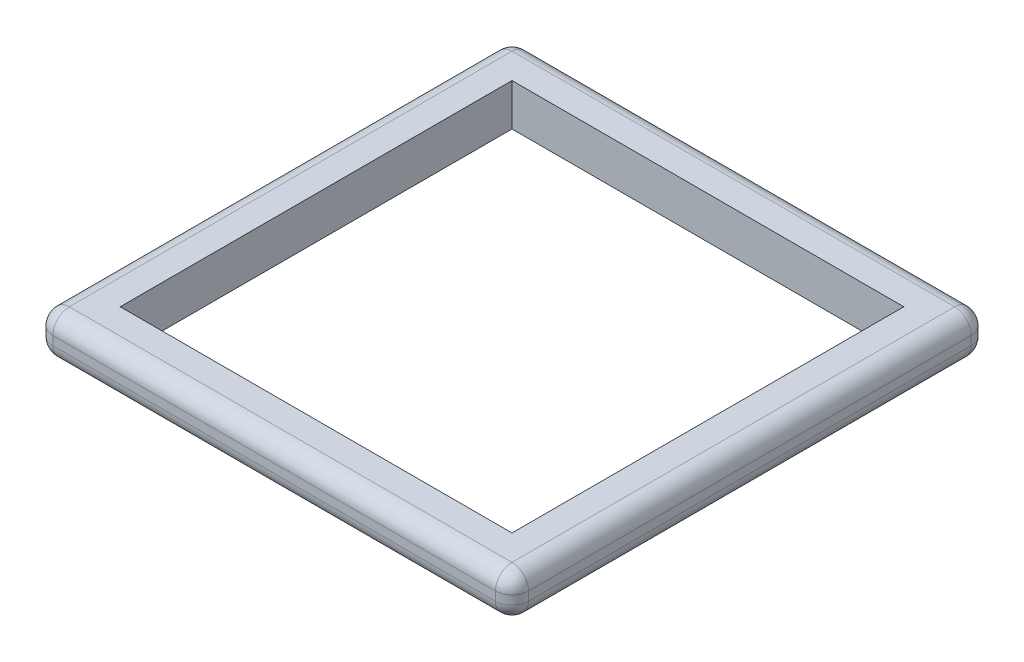
ISO-10303-21;
HEADER;
FILE_DESCRIPTION(('STEP AP214'),'2;1');
FILE_NAME('part.step','',(''),(''),'','','');
FILE_SCHEMA(('AUTOMOTIVE_DESIGN { 1 0 10303 214 1 1 1 1 }'));
ENDSEC;
DATA;
#1=APPLICATION_CONTEXT('core data for automotive mechanical design processes');
#2=APPLICATION_PROTOCOL_DEFINITION('international standard','automotive_design',2000,#1);
#3=PRODUCT_CONTEXT('',#1,'mechanical');
#4=PRODUCT('Part','Part','',(#3));
#5=PRODUCT_RELATED_PRODUCT_CATEGORY('part','',(#4));
#6=PRODUCT_DEFINITION_FORMATION('','',#4);
#7=PRODUCT_DEFINITION_CONTEXT('part definition',#1,'design');
#8=PRODUCT_DEFINITION('design','',#6,#7);
#9=PRODUCT_DEFINITION_SHAPE('','',#8);
#10=(LENGTH_UNIT() NAMED_UNIT(*) SI_UNIT(.MILLI.,.METRE.));
#11=(NAMED_UNIT(*) PLANE_ANGLE_UNIT() SI_UNIT($,.RADIAN.));
#12=(NAMED_UNIT(*) SI_UNIT($,.STERADIAN.) SOLID_ANGLE_UNIT());
#13=UNCERTAINTY_MEASURE_WITH_UNIT(LENGTH_MEASURE(1.E-05),#10,'distance_accuracy_value','');
#14=(GEOMETRIC_REPRESENTATION_CONTEXT(3) GLOBAL_UNCERTAINTY_ASSIGNED_CONTEXT((#13)) GLOBAL_UNIT_ASSIGNED_CONTEXT((#10,
#11,#12)) REPRESENTATION_CONTEXT('',''));
#15=CARTESIAN_POINT('',(0.,0.,0.));
#16=DIRECTION('',(0.,0.,1.));
#17=DIRECTION('',(1.,0.,0.));
#18=AXIS2_PLACEMENT_3D('',#15,#16,#17);
#19=CARTESIAN_POINT('',(0.,76.2,0.));
#20=DIRECTION('',(0.,1.,0.));
#21=DIRECTION('',(0.,0.,1.));
#22=AXIS2_PLACEMENT_3D('',#19,#20,#21);
#23=PLANE('',#22);
#24=DIRECTION('',(0.,0.,1.));
#25=VECTOR('',#24,1.);
#26=CARTESIAN_POINT('',(-757.4,76.2,787.4));
#27=LINE('',#26,#25);
#28=CARTESIAN_POINT('',(-757.4,76.2,-46.1999999999999));
#29=VERTEX_POINT('',#28);
#30=CARTESIAN_POINT('',(-757.4,76.2,757.4));
#31=VERTEX_POINT('',#30);
#32=EDGE_CURVE('E239',#29,#31,#27,.T.);
#33=ORIENTED_EDGE('',*,*,#32,.T.);
#34=DIRECTION('',(1.,0.,0.));
#35=VECTOR('',#34,1.);
#36=CARTESIAN_POINT('',(76.2000000000001,76.2,757.4));
#37=LINE('',#36,#35);
#38=CARTESIAN_POINT('',(46.2000000000001,76.2,757.4));
#39=VERTEX_POINT('',#38);
#40=EDGE_CURVE('E242',#31,#39,#37,.T.);
#41=ORIENTED_EDGE('',*,*,#40,.T.);
#42=DIRECTION('',(0.,0.,-1.));
#43=VECTOR('',#42,1.);
#44=CARTESIAN_POINT('',(46.2,76.2,-76.2));
#45=LINE('',#44,#43);
#46=CARTESIAN_POINT('',(46.2,76.2,-46.2));
#47=VERTEX_POINT('',#46);
#48=EDGE_CURVE('E201',#39,#47,#45,.T.);
#49=ORIENTED_EDGE('',*,*,#48,.T.);
#50=DIRECTION('',(-1.,0.,0.));
#51=VECTOR('',#50,1.);
#52=CARTESIAN_POINT('',(-787.4,76.2,-46.1999999999999));
#53=LINE('',#52,#51);
#54=EDGE_CURVE('E236',#47,#29,#53,.T.);
#55=ORIENTED_EDGE('',*,*,#54,.T.);
#56=EDGE_LOOP('',(#33,#41,#49,#55));
#57=FACE_BOUND('',#56,.T.);
#58=DIRECTION('',(-1.,0.,0.));
#59=VECTOR('',#58,1.);
#60=CARTESIAN_POINT('',(0.,76.2,0.));
#61=LINE('',#60,#59);
#62=CARTESIAN_POINT('',(0.,76.2,0.));
#63=VERTEX_POINT('',#62);
#64=CARTESIAN_POINT('',(-711.2,76.2,0.));
#65=VERTEX_POINT('',#64);
#66=EDGE_CURVE('E192',#63,#65,#61,.T.);
#67=ORIENTED_EDGE('',*,*,#66,.F.);
#68=DIRECTION('',(0.,0.,-1.));
#69=VECTOR('',#68,1.);
#70=CARTESIAN_POINT('',(0.,76.2,0.));
#71=LINE('',#70,#69);
#72=CARTESIAN_POINT('',(0.,76.2,711.2));
#73=VERTEX_POINT('',#72);
#74=EDGE_CURVE('E181',#73,#63,#71,.T.);
#75=ORIENTED_EDGE('',*,*,#74,.F.);
#76=DIRECTION('',(1.,0.,0.));
#77=VECTOR('',#76,1.);
#78=CARTESIAN_POINT('',(0.,76.2,711.2));
#79=LINE('',#78,#77);
#80=CARTESIAN_POINT('',(-711.2,76.2,711.2));
#81=VERTEX_POINT('',#80);
#82=EDGE_CURVE('E210',#81,#73,#79,.T.);
#83=ORIENTED_EDGE('',*,*,#82,.F.);
#84=DIRECTION('',(0.,0.,1.));
#85=VECTOR('',#84,1.);
#86=CARTESIAN_POINT('',(-711.2,76.2,0.));
#87=LINE('',#86,#85);
#88=EDGE_CURVE('E206',#65,#81,#87,.T.);
#89=ORIENTED_EDGE('',*,*,#88,.F.);
#90=EDGE_LOOP('',(#67,#75,#83,#89));
#91=FACE_BOUND('',#90,.T.);
#92=ADVANCED_FACE('F63',(#57,#91),#23,.T.);
#93=CARTESIAN_POINT('',(0.,0.,0.));
#94=DIRECTION('',(0.,1.,0.));
#95=DIRECTION('',(0.,0.,1.));
#96=AXIS2_PLACEMENT_3D('',#93,#94,#95);
#97=PLANE('',#96);
#98=DIRECTION('',(1.,0.,0.));
#99=VECTOR('',#98,1.);
#100=CARTESIAN_POINT('',(1.18234381165789E-13,0.,757.4));
#101=LINE('',#100,#99);
#102=CARTESIAN_POINT('',(46.2000000000001,0.,757.4));
#103=VERTEX_POINT('',#102);
#104=CARTESIAN_POINT('',(-757.4,0.,757.4));
#105=VERTEX_POINT('',#104);
#106=EDGE_CURVE('E88',#103,#105,#101,.F.);
#107=ORIENTED_EDGE('',*,*,#106,.T.);
#108=DIRECTION('',(0.,0.,1.));
#109=VECTOR('',#108,1.);
#110=CARTESIAN_POINT('',(-757.4,0.,2.36468762331579E-13));
#111=LINE('',#110,#109);
#112=CARTESIAN_POINT('',(-757.4,0.,-46.1999999999999));
#113=VERTEX_POINT('',#112);
#114=EDGE_CURVE('E12',#105,#113,#111,.F.);
#115=ORIENTED_EDGE('',*,*,#114,.T.);
#116=DIRECTION('',(-1.,0.,0.));
#117=VECTOR('',#116,1.);
#118=CARTESIAN_POINT('',(0.,0.,-46.2));
#119=LINE('',#118,#117);
#120=CARTESIAN_POINT('',(46.2,0.,-46.2));
#121=VERTEX_POINT('',#120);
#122=EDGE_CURVE('E73',#113,#121,#119,.F.);
#123=ORIENTED_EDGE('',*,*,#122,.T.);
#124=DIRECTION('',(0.,0.,-1.));
#125=VECTOR('',#124,1.);
#126=CARTESIAN_POINT('',(46.2,0.,0.));
#127=LINE('',#126,#125);
#128=EDGE_CURVE('E298',#121,#103,#127,.F.);
#129=ORIENTED_EDGE('',*,*,#128,.T.);
#130=EDGE_LOOP('',(#107,#115,#123,#129));
#131=FACE_BOUND('',#130,.T.);
#132=DIRECTION('',(0.,0.,-1.));
#133=VECTOR('',#132,1.);
#134=CARTESIAN_POINT('',(0.,0.,0.));
#135=LINE('',#134,#133);
#136=CARTESIAN_POINT('',(0.,0.,711.2));
#137=VERTEX_POINT('',#136);
#138=CARTESIAN_POINT('',(0.,0.,0.));
#139=VERTEX_POINT('',#138);
#140=EDGE_CURVE('E215',#137,#139,#135,.T.);
#141=ORIENTED_EDGE('',*,*,#140,.T.);
#142=DIRECTION('',(-1.,0.,0.));
#143=VECTOR('',#142,1.);
#144=CARTESIAN_POINT('',(0.,0.,0.));
#145=LINE('',#144,#143);
#146=CARTESIAN_POINT('',(-711.2,0.,0.));
#147=VERTEX_POINT('',#146);
#148=EDGE_CURVE('E199',#139,#147,#145,.T.);
#149=ORIENTED_EDGE('',*,*,#148,.T.);
#150=DIRECTION('',(0.,0.,1.));
#151=VECTOR('',#150,1.);
#152=CARTESIAN_POINT('',(-711.2,0.,0.));
#153=LINE('',#152,#151);
#154=CARTESIAN_POINT('',(-711.2,0.,711.2));
#155=VERTEX_POINT('',#154);
#156=EDGE_CURVE('E220',#147,#155,#153,.T.);
#157=ORIENTED_EDGE('',*,*,#156,.T.);
#158=DIRECTION('',(1.,0.,0.));
#159=VECTOR('',#158,1.);
#160=CARTESIAN_POINT('',(0.,0.,711.2));
#161=LINE('',#160,#159);
#162=EDGE_CURVE('E193',#155,#137,#161,.T.);
#163=ORIENTED_EDGE('',*,*,#162,.T.);
#164=EDGE_LOOP('',(#141,#149,#157,#163));
#165=FACE_BOUND('',#164,.T.);
#166=ADVANCED_FACE('F401',(#131,#165),#97,.F.);
#167=CARTESIAN_POINT('',(76.2,76.2,0.));
#168=DIRECTION('',(-1.,0.,0.));
#169=DIRECTION('',(0.,0.,1.));
#170=AXIS2_PLACEMENT_3D('',#167,#168,#169);
#171=PLANE('',#170);
#172=DIRECTION('',(0.,-1.,0.));
#173=VECTOR('',#172,1.);
#174=CARTESIAN_POINT('',(76.2,76.2,-46.2));
#175=LINE('',#174,#173);
#176=CARTESIAN_POINT('',(76.2,30.,-46.2));
#177=VERTEX_POINT('',#176);
#178=CARTESIAN_POINT('',(76.2,46.2,-46.2));
#179=VERTEX_POINT('',#178);
#180=EDGE_CURVE('E291',#177,#179,#175,.F.);
#181=ORIENTED_EDGE('',*,*,#180,.T.);
#182=DIRECTION('',(0.,0.,-1.));
#183=VECTOR('',#182,1.);
#184=CARTESIAN_POINT('',(76.2000000000001,46.2,787.4));
#185=LINE('',#184,#183);
#186=CARTESIAN_POINT('',(76.2000000000001,46.2,757.4));
#187=VERTEX_POINT('',#186);
#188=EDGE_CURVE('E294',#179,#187,#185,.F.);
#189=ORIENTED_EDGE('',*,*,#188,.T.);
#190=DIRECTION('',(0.,-1.,0.));
#191=VECTOR('',#190,1.);
#192=CARTESIAN_POINT('',(76.2000000000001,76.2,757.4));
#193=LINE('',#192,#191);
#194=CARTESIAN_POINT('',(76.2000000000001,30.,757.4));
#195=VERTEX_POINT('',#194);
#196=EDGE_CURVE('E288',#187,#195,#193,.T.);
#197=ORIENTED_EDGE('',*,*,#196,.T.);
#198=DIRECTION('',(0.,0.,-1.));
#199=VECTOR('',#198,1.);
#200=CARTESIAN_POINT('',(76.2,30.,0.));
#201=LINE('',#200,#199);
#202=EDGE_CURVE('E285',#195,#177,#201,.T.);
#203=ORIENTED_EDGE('',*,*,#202,.T.);
#204=EDGE_LOOP('',(#181,#189,#197,#203));
#205=FACE_BOUND('',#204,.T.);
#206=ADVANCED_FACE('F482',(#205),#171,.F.);
#207=CARTESIAN_POINT('',(0.,76.2,-76.2));
#208=DIRECTION('',(0.,0.,1.));
#209=DIRECTION('',(1.,0.,0.));
#210=AXIS2_PLACEMENT_3D('',#207,#208,#209);
#211=PLANE('',#210);
#212=DIRECTION('',(0.,-1.,0.));
#213=VECTOR('',#212,1.);
#214=CARTESIAN_POINT('',(-757.4,76.2,-76.1999999999999));
#215=LINE('',#214,#213);
#216=CARTESIAN_POINT('',(-757.4,30.,-76.1999999999999));
#217=VERTEX_POINT('',#216);
#218=CARTESIAN_POINT('',(-757.4,46.2,-76.1999999999999));
#219=VERTEX_POINT('',#218);
#220=EDGE_CURVE('E278',#217,#219,#215,.F.);
#221=ORIENTED_EDGE('',*,*,#220,.T.);
#222=DIRECTION('',(-1.,0.,0.));
#223=VECTOR('',#222,1.);
#224=CARTESIAN_POINT('',(76.2,46.2,-76.2));
#225=LINE('',#224,#223);
#226=CARTESIAN_POINT('',(46.2,46.2,-76.2));
#227=VERTEX_POINT('',#226);
#228=EDGE_CURVE('E281',#219,#227,#225,.F.);
#229=ORIENTED_EDGE('',*,*,#228,.T.);
#230=DIRECTION('',(0.,-1.,0.));
#231=VECTOR('',#230,1.);
#232=CARTESIAN_POINT('',(46.2,76.2,-76.2));
#233=LINE('',#232,#231);
#234=CARTESIAN_POINT('',(46.2,30.,-76.2));
#235=VERTEX_POINT('',#234);
#236=EDGE_CURVE('E275',#227,#235,#233,.T.);
#237=ORIENTED_EDGE('',*,*,#236,.T.);
#238=DIRECTION('',(-1.,0.,0.));
#239=VECTOR('',#238,1.);
#240=CARTESIAN_POINT('',(0.,30.,-76.2));
#241=LINE('',#240,#239);
#242=EDGE_CURVE('E272',#235,#217,#241,.T.);
#243=ORIENTED_EDGE('',*,*,#242,.T.);
#244=EDGE_LOOP('',(#221,#229,#237,#243));
#245=FACE_BOUND('',#244,.T.);
#246=ADVANCED_FACE('F437',(#245),#211,.F.);
#247=CARTESIAN_POINT('',(-787.4,76.2,2.45835098309856E-13));
#248=DIRECTION('',(1.,0.,0.));
#249=DIRECTION('',(0.,0.,-1.));
#250=AXIS2_PLACEMENT_3D('',#247,#248,#249);
#251=PLANE('',#250);
#252=DIRECTION('',(0.,-1.,0.));
#253=VECTOR('',#252,1.);
#254=CARTESIAN_POINT('',(-787.4,76.2,757.4));
#255=LINE('',#254,#253);
#256=CARTESIAN_POINT('',(-787.4,30.,757.4));
#257=VERTEX_POINT('',#256);
#258=CARTESIAN_POINT('',(-787.4,46.2,757.4));
#259=VERTEX_POINT('',#258);
#260=EDGE_CURVE('E262',#257,#259,#255,.F.);
#261=ORIENTED_EDGE('',*,*,#260,.T.);
#262=DIRECTION('',(0.,0.,1.));
#263=VECTOR('',#262,1.);
#264=CARTESIAN_POINT('',(-787.4,46.2,-76.1999999999999));
#265=LINE('',#264,#263);
#266=CARTESIAN_POINT('',(-787.4,46.2,-46.1999999999999));
#267=VERTEX_POINT('',#266);
#268=EDGE_CURVE('E268',#259,#267,#265,.F.);
#269=ORIENTED_EDGE('',*,*,#268,.T.);
#270=DIRECTION('',(0.,-1.,0.));
#271=VECTOR('',#270,1.);
#272=CARTESIAN_POINT('',(-787.4,76.2,-46.1999999999999));
#273=LINE('',#272,#271);
#274=CARTESIAN_POINT('',(-787.4,30.,-46.1999999999999));
#275=VERTEX_POINT('',#274);
#276=EDGE_CURVE('E265',#267,#275,#273,.T.);
#277=ORIENTED_EDGE('',*,*,#276,.T.);
#278=DIRECTION('',(0.,0.,1.));
#279=VECTOR('',#278,1.);
#280=CARTESIAN_POINT('',(-787.4,30.,2.45835098309856E-13));
#281=LINE('',#280,#279);
#282=EDGE_CURVE('E259',#275,#257,#281,.T.);
#283=ORIENTED_EDGE('',*,*,#282,.T.);
#284=EDGE_LOOP('',(#261,#269,#277,#283));
#285=FACE_BOUND('',#284,.T.);
#286=ADVANCED_FACE('F421',(#285),#251,.F.);
#287=CARTESIAN_POINT('',(1.22917549154928E-13,76.2,787.4));
#288=DIRECTION('',(0.,0.,-1.));
#289=DIRECTION('',(-1.,0.,0.));
#290=AXIS2_PLACEMENT_3D('',#287,#288,#289);
#291=PLANE('',#290);
#292=DIRECTION('',(0.,-1.,0.));
#293=VECTOR('',#292,1.);
#294=CARTESIAN_POINT('',(46.2000000000001,76.2,787.4));
#295=LINE('',#294,#293);
#296=CARTESIAN_POINT('',(46.2000000000001,30.,787.4));
#297=VERTEX_POINT('',#296);
#298=CARTESIAN_POINT('',(46.2000000000001,46.2,787.4));
#299=VERTEX_POINT('',#298);
#300=EDGE_CURVE('E249',#297,#299,#295,.F.);
#301=ORIENTED_EDGE('',*,*,#300,.T.);
#302=DIRECTION('',(1.,0.,0.));
#303=VECTOR('',#302,1.);
#304=CARTESIAN_POINT('',(-787.4,46.2,787.4));
#305=LINE('',#304,#303);
#306=CARTESIAN_POINT('',(-757.4,46.2,787.4));
#307=VERTEX_POINT('',#306);
#308=EDGE_CURVE('E255',#299,#307,#305,.F.);
#309=ORIENTED_EDGE('',*,*,#308,.T.);
#310=DIRECTION('',(0.,-1.,0.));
#311=VECTOR('',#310,1.);
#312=CARTESIAN_POINT('',(-757.4,76.2,787.4));
#313=LINE('',#312,#311);
#314=CARTESIAN_POINT('',(-757.4,30.,787.4));
#315=VERTEX_POINT('',#314);
#316=EDGE_CURVE('E252',#307,#315,#313,.T.);
#317=ORIENTED_EDGE('',*,*,#316,.T.);
#318=DIRECTION('',(1.,0.,0.));
#319=VECTOR('',#318,1.);
#320=CARTESIAN_POINT('',(1.22917549154928E-13,30.,787.4));
#321=LINE('',#320,#319);
#322=EDGE_CURVE('E246',#315,#297,#321,.T.);
#323=ORIENTED_EDGE('',*,*,#322,.T.);
#324=EDGE_LOOP('',(#301,#309,#317,#323));
#325=FACE_BOUND('',#324,.T.);
#326=ADVANCED_FACE('F464',(#325),#291,.F.);
#327=CARTESIAN_POINT('',(0.,76.2,0.));
#328=DIRECTION('',(-1.,0.,0.));
#329=DIRECTION('',(0.,0.,1.));
#330=AXIS2_PLACEMENT_3D('',#327,#328,#329);
#331=PLANE('',#330);
#332=ORIENTED_EDGE('',*,*,#140,.F.);
#333=DIRECTION('',(0.,-1.,0.));
#334=VECTOR('',#333,1.);
#335=CARTESIAN_POINT('',(0.,76.2,711.2));
#336=LINE('',#335,#334);
#337=EDGE_CURVE('E187',#73,#137,#336,.T.);
#338=ORIENTED_EDGE('',*,*,#337,.F.);
#339=ORIENTED_EDGE('',*,*,#74,.T.);
#340=DIRECTION('',(0.,-1.,0.));
#341=VECTOR('',#340,1.);
#342=CARTESIAN_POINT('',(0.,76.2,0.));
#343=LINE('',#342,#341);
#344=EDGE_CURVE('E184',#63,#139,#343,.T.);
#345=ORIENTED_EDGE('',*,*,#344,.T.);
#346=EDGE_LOOP('',(#332,#338,#339,#345));
#347=FACE_BOUND('',#346,.T.);
#348=ADVANCED_FACE('F183',(#347),#331,.T.);
#349=CARTESIAN_POINT('',(0.,76.2,0.));
#350=DIRECTION('',(0.,0.,1.));
#351=DIRECTION('',(1.,0.,0.));
#352=AXIS2_PLACEMENT_3D('',#349,#350,#351);
#353=PLANE('',#352);
#354=ORIENTED_EDGE('',*,*,#148,.F.);
#355=ORIENTED_EDGE('',*,*,#344,.F.);
#356=ORIENTED_EDGE('',*,*,#66,.T.);
#357=DIRECTION('',(0.,-1.,0.));
#358=VECTOR('',#357,1.);
#359=CARTESIAN_POINT('',(-711.2,76.2,0.));
#360=LINE('',#359,#358);
#361=EDGE_CURVE('E202',#65,#147,#360,.T.);
#362=ORIENTED_EDGE('',*,*,#361,.T.);
#363=EDGE_LOOP('',(#354,#355,#356,#362));
#364=FACE_BOUND('',#363,.T.);
#365=ADVANCED_FACE('F196',(#364),#353,.T.);
#366=CARTESIAN_POINT('',(-711.2,76.2,0.));
#367=DIRECTION('',(1.,0.,0.));
#368=DIRECTION('',(0.,0.,-1.));
#369=AXIS2_PLACEMENT_3D('',#366,#367,#368);
#370=PLANE('',#369);
#371=ORIENTED_EDGE('',*,*,#156,.F.);
#372=ORIENTED_EDGE('',*,*,#361,.F.);
#373=ORIENTED_EDGE('',*,*,#88,.T.);
#374=DIRECTION('',(0.,-1.,0.));
#375=VECTOR('',#374,1.);
#376=CARTESIAN_POINT('',(-711.2,76.2,711.2));
#377=LINE('',#376,#375);
#378=EDGE_CURVE('E229',#81,#155,#377,.T.);
#379=ORIENTED_EDGE('',*,*,#378,.T.);
#380=EDGE_LOOP('',(#371,#372,#373,#379));
#381=FACE_BOUND('',#380,.T.);
#382=ADVANCED_FACE('F542',(#381),#370,.T.);
#383=CARTESIAN_POINT('',(0.,76.2,711.2));
#384=DIRECTION('',(0.,0.,-1.));
#385=DIRECTION('',(-1.,0.,0.));
#386=AXIS2_PLACEMENT_3D('',#383,#384,#385);
#387=PLANE('',#386);
#388=ORIENTED_EDGE('',*,*,#162,.F.);
#389=ORIENTED_EDGE('',*,*,#378,.F.);
#390=ORIENTED_EDGE('',*,*,#82,.T.);
#391=ORIENTED_EDGE('',*,*,#337,.T.);
#392=EDGE_LOOP('',(#388,#389,#390,#391));
#393=FACE_BOUND('',#392,.T.);
#394=ADVANCED_FACE('F538',(#393),#387,.T.);
#395=CARTESIAN_POINT('',(0.,30.,-46.2));
#396=DIRECTION('',(-1.,0.,0.));
#397=DIRECTION('',(0.,0.,1.));
#398=AXIS2_PLACEMENT_3D('',#395,#396,#397);
#399=CYLINDRICAL_SURFACE('',#398,30.);
#400=CARTESIAN_POINT('',(-757.4,30.,-46.1999999999999));
#401=DIRECTION('',(-1.,0.,0.));
#402=DIRECTION('',(0.,0.,1.));
#403=AXIS2_PLACEMENT_3D('',#400,#401,#402);
#404=CIRCLE('',#403,30.);
#405=EDGE_CURVE('E67',#217,#113,#404,.T.);
#406=ORIENTED_EDGE('',*,*,#405,.F.);
#407=ORIENTED_EDGE('',*,*,#242,.F.);
#408=CARTESIAN_POINT('',(46.2,30.,-46.2));
#409=DIRECTION('',(1.,0.,0.));
#410=DIRECTION('',(0.,0.,-1.));
#411=AXIS2_PLACEMENT_3D('',#408,#409,#410);
#412=CIRCLE('',#411,30.);
#413=EDGE_CURVE('E385',#121,#235,#412,.T.);
#414=ORIENTED_EDGE('',*,*,#413,.F.);
#415=ORIENTED_EDGE('',*,*,#122,.F.);
#416=EDGE_LOOP('',(#406,#407,#414,#415));
#417=FACE_BOUND('',#416,.T.);
#418=ADVANCED_FACE('F65',(#417),#399,.T.);
#419=CARTESIAN_POINT('',(-757.4,30.,-46.1999999999999));
#420=DIRECTION('',(0.,-1.,0.));
#421=DIRECTION('',(0.,0.,-1.));
#422=AXIS2_PLACEMENT_3D('',#419,#420,#421);
#423=SPHERICAL_SURFACE('',#422,30.);
#424=CARTESIAN_POINT('',(-757.4,30.,-46.1999999999999));
#425=DIRECTION('',(0.,-1.,0.));
#426=DIRECTION('',(0.,0.,-1.));
#427=AXIS2_PLACEMENT_3D('',#424,#425,#426);
#428=CIRCLE('',#427,30.);
#429=EDGE_CURVE('E380',#217,#275,#428,.F.);
#430=ORIENTED_EDGE('',*,*,#429,.F.);
#431=ORIENTED_EDGE('',*,*,#405,.T.);
#432=CARTESIAN_POINT('',(-757.4,30.,-46.1999999999999));
#433=DIRECTION('',(0.,0.,-1.));
#434=DIRECTION('',(-1.,0.,0.));
#435=AXIS2_PLACEMENT_3D('',#432,#433,#434);
#436=CIRCLE('',#435,30.);
#437=EDGE_CURVE('E81',#275,#113,#436,.F.);
#438=ORIENTED_EDGE('',*,*,#437,.F.);
#439=EDGE_LOOP('',(#430,#431,#438));
#440=FACE_BOUND('',#439,.T.);
#441=ADVANCED_FACE('F397',(#440),#423,.T.);
#442=CARTESIAN_POINT('',(46.2,30.,-46.2));
#443=DIRECTION('',(0.,0.,-1.));
#444=DIRECTION('',(-1.,0.,0.));
#445=AXIS2_PLACEMENT_3D('',#442,#443,#444);
#446=SPHERICAL_SURFACE('',#445,30.);
#447=CARTESIAN_POINT('',(46.2,30.,-46.2));
#448=DIRECTION('',(0.,0.,-1.));
#449=DIRECTION('',(-1.,0.,0.));
#450=AXIS2_PLACEMENT_3D('',#447,#448,#449);
#451=CIRCLE('',#450,30.);
#452=EDGE_CURVE('E372',#121,#177,#451,.F.);
#453=ORIENTED_EDGE('',*,*,#452,.F.);
#454=ORIENTED_EDGE('',*,*,#413,.T.);
#455=CARTESIAN_POINT('',(46.2,30.,-46.2));
#456=DIRECTION('',(0.,-1.,0.));
#457=DIRECTION('',(0.,0.,-1.));
#458=AXIS2_PLACEMENT_3D('',#455,#456,#457);
#459=CIRCLE('',#458,30.);
#460=EDGE_CURVE('E376',#177,#235,#459,.F.);
#461=ORIENTED_EDGE('',*,*,#460,.F.);
#462=EDGE_LOOP('',(#453,#454,#461));
#463=FACE_BOUND('',#462,.T.);
#464=ADVANCED_FACE('F449',(#463),#446,.T.);
#465=CARTESIAN_POINT('',(-757.4,30.,2.36468762331579E-13));
#466=DIRECTION('',(0.,0.,1.));
#467=DIRECTION('',(1.,0.,0.));
#468=AXIS2_PLACEMENT_3D('',#465,#466,#467);
#469=CYLINDRICAL_SURFACE('',#468,30.);
#470=ORIENTED_EDGE('',*,*,#437,.T.);
#471=ORIENTED_EDGE('',*,*,#114,.F.);
#472=CARTESIAN_POINT('',(-757.4,30.,757.4));
#473=DIRECTION('',(0.,0.,1.));
#474=DIRECTION('',(1.,0.,0.));
#475=AXIS2_PLACEMENT_3D('',#472,#473,#474);
#476=CIRCLE('',#475,30.);
#477=EDGE_CURVE('E364',#257,#105,#476,.T.);
#478=ORIENTED_EDGE('',*,*,#477,.F.);
#479=ORIENTED_EDGE('',*,*,#282,.F.);
#480=EDGE_LOOP('',(#470,#471,#478,#479));
#481=FACE_BOUND('',#480,.T.);
#482=ADVANCED_FACE('F405',(#481),#469,.T.);
#483=CARTESIAN_POINT('',(-757.4,76.2,-46.1999999999999));
#484=DIRECTION('',(0.,-1.,0.));
#485=DIRECTION('',(0.,0.,-1.));
#486=AXIS2_PLACEMENT_3D('',#483,#484,#485);
#487=CYLINDRICAL_SURFACE('',#486,30.);
#488=ORIENTED_EDGE('',*,*,#429,.T.);
#489=ORIENTED_EDGE('',*,*,#276,.F.);
#490=CARTESIAN_POINT('',(-757.4,46.2,-46.1999999999999));
#491=DIRECTION('',(0.,1.,0.));
#492=DIRECTION('',(0.,0.,1.));
#493=AXIS2_PLACEMENT_3D('',#490,#491,#492);
#494=CIRCLE('',#493,30.);
#495=EDGE_CURVE('E360',#219,#267,#494,.T.);
#496=ORIENTED_EDGE('',*,*,#495,.F.);
#497=ORIENTED_EDGE('',*,*,#220,.F.);
#498=EDGE_LOOP('',(#488,#489,#496,#497));
#499=FACE_BOUND('',#498,.T.);
#500=ADVANCED_FACE('F434',(#499),#487,.T.);
#501=CARTESIAN_POINT('',(0.,46.2,-46.2));
#502=DIRECTION('',(1.,0.,0.));
#503=DIRECTION('',(0.,0.,-1.));
#504=AXIS2_PLACEMENT_3D('',#501,#502,#503);
#505=CYLINDRICAL_SURFACE('',#504,30.);
#506=CARTESIAN_POINT('',(46.2,46.2,-46.2));
#507=DIRECTION('',(1.,0.,0.));
#508=DIRECTION('',(0.,1.,0.));
#509=AXIS2_PLACEMENT_3D('',#506,#507,#508);
#510=CIRCLE('',#509,30.);
#511=EDGE_CURVE('E352',#227,#47,#510,.T.);
#512=ORIENTED_EDGE('',*,*,#511,.F.);
#513=ORIENTED_EDGE('',*,*,#228,.F.);
#514=CARTESIAN_POINT('',(-757.4,46.2,-46.1999999999999));
#515=DIRECTION('',(-1.,0.,0.));
#516=DIRECTION('',(0.,0.,1.));
#517=AXIS2_PLACEMENT_3D('',#514,#515,#516);
#518=CIRCLE('',#517,30.);
#519=EDGE_CURVE('E356',#29,#219,#518,.T.);
#520=ORIENTED_EDGE('',*,*,#519,.F.);
#521=ORIENTED_EDGE('',*,*,#54,.F.);
#522=EDGE_LOOP('',(#512,#513,#520,#521));
#523=FACE_BOUND('',#522,.T.);
#524=ADVANCED_FACE('F440',(#523),#505,.T.);
#525=CARTESIAN_POINT('',(46.2,76.2,-46.2));
#526=DIRECTION('',(0.,-1.,0.));
#527=DIRECTION('',(0.,0.,-1.));
#528=AXIS2_PLACEMENT_3D('',#525,#526,#527);
#529=CYLINDRICAL_SURFACE('',#528,30.);
#530=ORIENTED_EDGE('',*,*,#460,.T.);
#531=ORIENTED_EDGE('',*,*,#236,.F.);
#532=CARTESIAN_POINT('',(46.2,46.2,-46.2));
#533=DIRECTION('',(0.,1.,0.));
#534=DIRECTION('',(0.,0.,1.));
#535=AXIS2_PLACEMENT_3D('',#532,#533,#534);
#536=CIRCLE('',#535,30.);
#537=EDGE_CURVE('E349',#179,#227,#536,.T.);
#538=ORIENTED_EDGE('',*,*,#537,.F.);
#539=ORIENTED_EDGE('',*,*,#180,.F.);
#540=EDGE_LOOP('',(#530,#531,#538,#539));
#541=FACE_BOUND('',#540,.T.);
#542=ADVANCED_FACE('F447',(#541),#529,.T.);
#543=CARTESIAN_POINT('',(46.2,30.,0.));
#544=DIRECTION('',(0.,0.,-1.));
#545=DIRECTION('',(-1.,0.,0.));
#546=AXIS2_PLACEMENT_3D('',#543,#544,#545);
#547=CYLINDRICAL_SURFACE('',#546,30.);
#548=ORIENTED_EDGE('',*,*,#452,.T.);
#549=ORIENTED_EDGE('',*,*,#202,.F.);
#550=CARTESIAN_POINT('',(46.2000000000001,30.,757.4));
#551=DIRECTION('',(0.,0.,1.));
#552=DIRECTION('',(1.,0.,0.));
#553=AXIS2_PLACEMENT_3D('',#550,#551,#552);
#554=CIRCLE('',#553,30.);
#555=EDGE_CURVE('E345',#103,#195,#554,.T.);
#556=ORIENTED_EDGE('',*,*,#555,.F.);
#557=ORIENTED_EDGE('',*,*,#128,.F.);
#558=EDGE_LOOP('',(#548,#549,#556,#557));
#559=FACE_BOUND('',#558,.T.);
#560=ADVANCED_FACE('F453',(#559),#547,.T.);
#561=CARTESIAN_POINT('',(1.18234381165789E-13,30.,757.4));
#562=DIRECTION('',(1.,0.,0.));
#563=DIRECTION('',(0.,0.,-1.));
#564=AXIS2_PLACEMENT_3D('',#561,#562,#563);
#565=CYLINDRICAL_SURFACE('',#564,30.);
#566=CARTESIAN_POINT('',(-757.4,30.,757.4));
#567=DIRECTION('',(-1.,0.,0.));
#568=DIRECTION('',(0.,0.,1.));
#569=AXIS2_PLACEMENT_3D('',#566,#567,#568);
#570=CIRCLE('',#569,30.);
#571=EDGE_CURVE('E368',#105,#315,#570,.T.);
#572=ORIENTED_EDGE('',*,*,#571,.F.);
#573=ORIENTED_EDGE('',*,*,#106,.F.);
#574=CARTESIAN_POINT('',(46.2000000000001,30.,757.4));
#575=DIRECTION('',(1.,0.,0.));
#576=DIRECTION('',(0.,0.,-1.));
#577=AXIS2_PLACEMENT_3D('',#574,#575,#576);
#578=CIRCLE('',#577,30.);
#579=EDGE_CURVE('E341',#297,#103,#578,.T.);
#580=ORIENTED_EDGE('',*,*,#579,.F.);
#581=ORIENTED_EDGE('',*,*,#322,.F.);
#582=EDGE_LOOP('',(#572,#573,#580,#581));
#583=FACE_BOUND('',#582,.T.);
#584=ADVANCED_FACE('F409',(#583),#565,.T.);
#585=CARTESIAN_POINT('',(-757.4,30.,757.4));
#586=DIRECTION('',(0.,-1.,0.));
#587=DIRECTION('',(0.,0.,-1.));
#588=AXIS2_PLACEMENT_3D('',#585,#586,#587);
#589=SPHERICAL_SURFACE('',#588,30.);
#590=ORIENTED_EDGE('',*,*,#477,.T.);
#591=ORIENTED_EDGE('',*,*,#571,.T.);
#592=CARTESIAN_POINT('',(-757.4,30.,757.4));
#593=DIRECTION('',(0.,-1.,0.));
#594=DIRECTION('',(0.,0.,-1.));
#595=AXIS2_PLACEMENT_3D('',#592,#593,#594);
#596=CIRCLE('',#595,30.);
#597=EDGE_CURVE('E337',#257,#315,#596,.F.);
#598=ORIENTED_EDGE('',*,*,#597,.F.);
#599=EDGE_LOOP('',(#590,#591,#598));
#600=FACE_BOUND('',#599,.T.);
#601=ADVANCED_FACE('F413',(#600),#589,.T.);
#602=CARTESIAN_POINT('',(-757.4,46.2,-46.1999999999999));
#603=DIRECTION('',(0.,0.,-1.));
#604=DIRECTION('',(-1.,0.,0.));
#605=AXIS2_PLACEMENT_3D('',#602,#603,#604);
#606=SPHERICAL_SURFACE('',#605,30.);
#607=ORIENTED_EDGE('',*,*,#519,.T.);
#608=ORIENTED_EDGE('',*,*,#495,.T.);
#609=CARTESIAN_POINT('',(-757.4,46.2,-46.1999999999999));
#610=DIRECTION('',(0.,0.,-1.));
#611=DIRECTION('',(0.,1.,0.));
#612=AXIS2_PLACEMENT_3D('',#609,#610,#611);
#613=CIRCLE('',#612,30.);
#614=EDGE_CURVE('E334',#29,#267,#613,.F.);
#615=ORIENTED_EDGE('',*,*,#614,.F.);
#616=EDGE_LOOP('',(#607,#608,#615));
#617=FACE_BOUND('',#616,.T.);
#618=ADVANCED_FACE('F431',(#617),#606,.T.);
#619=CARTESIAN_POINT('',(46.2,46.2,-46.2));
#620=DIRECTION('',(0.,0.,-1.));
#621=DIRECTION('',(-1.,0.,0.));
#622=AXIS2_PLACEMENT_3D('',#619,#620,#621);
#623=SPHERICAL_SURFACE('',#622,30.);
#624=ORIENTED_EDGE('',*,*,#537,.T.);
#625=ORIENTED_EDGE('',*,*,#511,.T.);
#626=CARTESIAN_POINT('',(46.2,46.2,-46.2));
#627=DIRECTION('',(0.,0.,-1.));
#628=DIRECTION('',(-1.,0.,0.));
#629=AXIS2_PLACEMENT_3D('',#626,#627,#628);
#630=CIRCLE('',#629,30.);
#631=EDGE_CURVE('E330',#179,#47,#630,.F.);
#632=ORIENTED_EDGE('',*,*,#631,.F.);
#633=EDGE_LOOP('',(#624,#625,#632));
#634=FACE_BOUND('',#633,.T.);
#635=ADVANCED_FACE('F514',(#634),#623,.T.);
#636=CARTESIAN_POINT('',(46.2000000000001,30.,757.4));
#637=DIRECTION('',(0.,-1.,0.));
#638=DIRECTION('',(0.,0.,-1.));
#639=AXIS2_PLACEMENT_3D('',#636,#637,#638);
#640=SPHERICAL_SURFACE('',#639,30.);
#641=ORIENTED_EDGE('',*,*,#579,.T.);
#642=ORIENTED_EDGE('',*,*,#555,.T.);
#643=CARTESIAN_POINT('',(46.2000000000001,30.,757.4));
#644=DIRECTION('',(0.,-1.,0.));
#645=DIRECTION('',(0.,0.,-1.));
#646=AXIS2_PLACEMENT_3D('',#643,#644,#645);
#647=CIRCLE('',#646,30.);
#648=EDGE_CURVE('E326',#297,#195,#647,.F.);
#649=ORIENTED_EDGE('',*,*,#648,.F.);
#650=EDGE_LOOP('',(#641,#642,#649));
#651=FACE_BOUND('',#650,.T.);
#652=ADVANCED_FACE('F456',(#651),#640,.T.);
#653=CARTESIAN_POINT('',(-757.4,76.2,757.4));
#654=DIRECTION('',(0.,-1.,0.));
#655=DIRECTION('',(0.,0.,-1.));
#656=AXIS2_PLACEMENT_3D('',#653,#654,#655);
#657=CYLINDRICAL_SURFACE('',#656,30.);
#658=ORIENTED_EDGE('',*,*,#597,.T.);
#659=ORIENTED_EDGE('',*,*,#316,.F.);
#660=CARTESIAN_POINT('',(-757.4,46.2,757.4));
#661=DIRECTION('',(0.,1.,0.));
#662=DIRECTION('',(0.,0.,1.));
#663=AXIS2_PLACEMENT_3D('',#660,#661,#662);
#664=CIRCLE('',#663,30.);
#665=EDGE_CURVE('E322',#259,#307,#664,.T.);
#666=ORIENTED_EDGE('',*,*,#665,.F.);
#667=ORIENTED_EDGE('',*,*,#260,.F.);
#668=EDGE_LOOP('',(#658,#659,#666,#667));
#669=FACE_BOUND('',#668,.T.);
#670=ADVANCED_FACE('F418',(#669),#657,.T.);
#671=CARTESIAN_POINT('',(-757.4,46.2,2.36468762331579E-13));
#672=DIRECTION('',(0.,0.,-1.));
#673=DIRECTION('',(-1.,0.,0.));
#674=AXIS2_PLACEMENT_3D('',#671,#672,#673);
#675=CYLINDRICAL_SURFACE('',#674,30.);
#676=ORIENTED_EDGE('',*,*,#614,.T.);
#677=ORIENTED_EDGE('',*,*,#268,.F.);
#678=CARTESIAN_POINT('',(-757.4,46.2,757.4));
#679=DIRECTION('',(0.,0.,1.));
#680=DIRECTION('',(1.,0.,0.));
#681=AXIS2_PLACEMENT_3D('',#678,#679,#680);
#682=CIRCLE('',#681,30.);
#683=EDGE_CURVE('E318',#31,#259,#682,.T.);
#684=ORIENTED_EDGE('',*,*,#683,.F.);
#685=ORIENTED_EDGE('',*,*,#32,.F.);
#686=EDGE_LOOP('',(#676,#677,#684,#685));
#687=FACE_BOUND('',#686,.T.);
#688=ADVANCED_FACE('F424',(#687),#675,.T.);
#689=CARTESIAN_POINT('',(46.2,46.2,0.));
#690=DIRECTION('',(0.,0.,1.));
#691=DIRECTION('',(1.,0.,0.));
#692=AXIS2_PLACEMENT_3D('',#689,#690,#691);
#693=CYLINDRICAL_SURFACE('',#692,30.);
#694=ORIENTED_EDGE('',*,*,#631,.T.);
#695=ORIENTED_EDGE('',*,*,#48,.F.);
#696=CARTESIAN_POINT('',(46.2000000000001,46.2,757.4));
#697=DIRECTION('',(0.,0.,1.));
#698=DIRECTION('',(1.,0.,0.));
#699=AXIS2_PLACEMENT_3D('',#696,#697,#698);
#700=CIRCLE('',#699,30.);
#701=EDGE_CURVE('E314',#187,#39,#700,.T.);
#702=ORIENTED_EDGE('',*,*,#701,.F.);
#703=ORIENTED_EDGE('',*,*,#188,.F.);
#704=EDGE_LOOP('',(#694,#695,#702,#703));
#705=FACE_BOUND('',#704,.T.);
#706=ADVANCED_FACE('F475',(#705),#693,.T.);
#707=CARTESIAN_POINT('',(46.2000000000001,76.2,757.4));
#708=DIRECTION('',(0.,-1.,0.));
#709=DIRECTION('',(0.,0.,-1.));
#710=AXIS2_PLACEMENT_3D('',#707,#708,#709);
#711=CYLINDRICAL_SURFACE('',#710,30.);
#712=ORIENTED_EDGE('',*,*,#648,.T.);
#713=ORIENTED_EDGE('',*,*,#196,.F.);
#714=CARTESIAN_POINT('',(46.2000000000001,46.2,757.4));
#715=DIRECTION('',(0.,1.,0.));
#716=DIRECTION('',(0.,0.,1.));
#717=AXIS2_PLACEMENT_3D('',#714,#715,#716);
#718=CIRCLE('',#717,30.);
#719=EDGE_CURVE('E311',#299,#187,#718,.T.);
#720=ORIENTED_EDGE('',*,*,#719,.F.);
#721=ORIENTED_EDGE('',*,*,#300,.F.);
#722=EDGE_LOOP('',(#712,#713,#720,#721));
#723=FACE_BOUND('',#722,.T.);
#724=ADVANCED_FACE('F461',(#723),#711,.T.);
#725=CARTESIAN_POINT('',(-757.4,46.2,757.4));
#726=DIRECTION('',(-1.,0.,0.));
#727=DIRECTION('',(0.,0.,1.));
#728=AXIS2_PLACEMENT_3D('',#725,#726,#727);
#729=SPHERICAL_SURFACE('',#728,30.);
#730=ORIENTED_EDGE('',*,*,#683,.T.);
#731=ORIENTED_EDGE('',*,*,#665,.T.);
#732=CARTESIAN_POINT('',(-757.4,46.2,757.4));
#733=DIRECTION('',(-1.,0.,0.));
#734=DIRECTION('',(0.,0.,1.));
#735=AXIS2_PLACEMENT_3D('',#732,#733,#734);
#736=CIRCLE('',#735,30.);
#737=EDGE_CURVE('E308',#31,#307,#736,.F.);
#738=ORIENTED_EDGE('',*,*,#737,.F.);
#739=EDGE_LOOP('',(#730,#731,#738));
#740=FACE_BOUND('',#739,.T.);
#741=ADVANCED_FACE('F500',(#740),#729,.T.);
#742=CARTESIAN_POINT('',(46.2000000000001,46.2,757.4));
#743=DIRECTION('',(1.,0.,0.));
#744=DIRECTION('',(0.,0.,-1.));
#745=AXIS2_PLACEMENT_3D('',#742,#743,#744);
#746=SPHERICAL_SURFACE('',#745,30.);
#747=ORIENTED_EDGE('',*,*,#719,.T.);
#748=ORIENTED_EDGE('',*,*,#701,.T.);
#749=CARTESIAN_POINT('',(46.2000000000001,46.2,757.4));
#750=DIRECTION('',(1.,0.,0.));
#751=DIRECTION('',(0.,0.,-1.));
#752=AXIS2_PLACEMENT_3D('',#749,#750,#751);
#753=CIRCLE('',#752,30.);
#754=EDGE_CURVE('E305',#299,#39,#753,.F.);
#755=ORIENTED_EDGE('',*,*,#754,.F.);
#756=EDGE_LOOP('',(#747,#748,#755));
#757=FACE_BOUND('',#756,.T.);
#758=ADVANCED_FACE('F470',(#757),#746,.T.);
#759=CARTESIAN_POINT('',(1.18234381165789E-13,46.2,757.4));
#760=DIRECTION('',(-1.,0.,0.));
#761=DIRECTION('',(0.,0.,1.));
#762=AXIS2_PLACEMENT_3D('',#759,#760,#761);
#763=CYLINDRICAL_SURFACE('',#762,30.);
#764=ORIENTED_EDGE('',*,*,#737,.T.);
#765=ORIENTED_EDGE('',*,*,#308,.F.);
#766=ORIENTED_EDGE('',*,*,#754,.T.);
#767=ORIENTED_EDGE('',*,*,#40,.F.);
#768=EDGE_LOOP('',(#764,#765,#766,#767));
#769=FACE_BOUND('',#768,.T.);
#770=ADVANCED_FACE('F467',(#769),#763,.T.);
#771=CLOSED_SHELL('',(#92,#166,#206,#246,#286,#326,#348,#365,#382,#394,#418,#441,#464,#482,#500,
#524,#542,#560,#584,#601,#618,#635,#652,#670,#688,#706,#724,#741,#758,#770));
#772=MANIFOLD_SOLID_BREP('B2',#771);
#773=ADVANCED_BREP_SHAPE_REPRESENTATION('',(#18,#772),#14);
#774=SHAPE_DEFINITION_REPRESENTATION(#9,#773);
ENDSEC;
END-ISO-10303-21;
